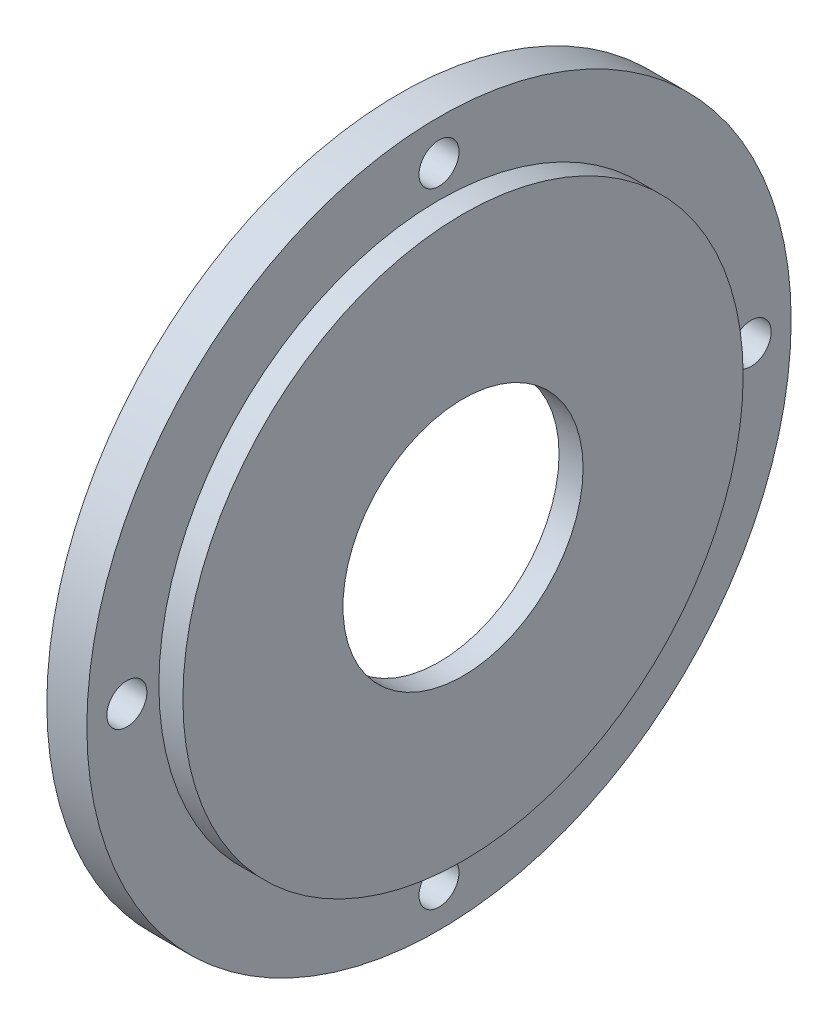
ISO-10303-21;
HEADER;
FILE_DESCRIPTION(('STEP AP214'),'2;1');
FILE_NAME('part.step','',(''),(''),'','','');
FILE_SCHEMA(('AUTOMOTIVE_DESIGN { 1 0 10303 214 1 1 1 1 }'));
ENDSEC;
DATA;
#1=APPLICATION_CONTEXT('core data for automotive mechanical design processes');
#2=APPLICATION_PROTOCOL_DEFINITION('international standard','automotive_design',2000,#1);
#3=PRODUCT_CONTEXT('',#1,'mechanical');
#4=PRODUCT('Part','Part','',(#3));
#5=PRODUCT_RELATED_PRODUCT_CATEGORY('part','',(#4));
#6=PRODUCT_DEFINITION_FORMATION('','',#4);
#7=PRODUCT_DEFINITION_CONTEXT('part definition',#1,'design');
#8=PRODUCT_DEFINITION('design','',#6,#7);
#9=PRODUCT_DEFINITION_SHAPE('','',#8);
#10=(LENGTH_UNIT() NAMED_UNIT(*) SI_UNIT(.MILLI.,.METRE.));
#11=(NAMED_UNIT(*) PLANE_ANGLE_UNIT() SI_UNIT($,.RADIAN.));
#12=(NAMED_UNIT(*) SI_UNIT($,.STERADIAN.) SOLID_ANGLE_UNIT());
#13=UNCERTAINTY_MEASURE_WITH_UNIT(LENGTH_MEASURE(1.E-05),#10,'distance_accuracy_value','');
#14=(GEOMETRIC_REPRESENTATION_CONTEXT(3) GLOBAL_UNCERTAINTY_ASSIGNED_CONTEXT((#13)) GLOBAL_UNIT_ASSIGNED_CONTEXT((#10,
#11,#12)) REPRESENTATION_CONTEXT('',''));
#15=CARTESIAN_POINT('',(0.,0.,0.));
#16=DIRECTION('',(0.,0.,1.));
#17=DIRECTION('',(1.,0.,0.));
#18=AXIS2_PLACEMENT_3D('',#15,#16,#17);
#19=CARTESIAN_POINT('',(5.,0.,0.));
#20=DIRECTION('',(1.,0.,0.));
#21=DIRECTION('',(0.,0.,-1.));
#22=AXIS2_PLACEMENT_3D('',#19,#20,#21);
#23=PLANE('',#22);
#24=CARTESIAN_POINT('',(5.,39.,0.));
#25=DIRECTION('',(1.,0.,0.));
#26=DIRECTION('',(0.,0.,-1.));
#27=AXIS2_PLACEMENT_3D('',#24,#25,#26);
#28=CIRCLE('',#27,2.50000000000267);
#29=CARTESIAN_POINT('',(5.,39.,-2.50000000000267));
#30=VERTEX_POINT('',#29);
#31=EDGE_CURVE('E90',#30,#30,#28,.T.);
#32=ORIENTED_EDGE('',*,*,#31,.F.);
#33=EDGE_LOOP('',(#32));
#34=FACE_BOUND('',#33,.T.);
#35=CARTESIAN_POINT('',(5.,1.24216638436362E-12,-39.0000000000012));
#36=DIRECTION('',(1.,0.,0.));
#37=DIRECTION('',(0.,0.,-1.));
#38=AXIS2_PLACEMENT_3D('',#35,#36,#37);
#39=CIRCLE('',#38,2.50000000000267);
#40=CARTESIAN_POINT('',(5.,1.24216638436362E-12,-41.5000000000039));
#41=VERTEX_POINT('',#40);
#42=EDGE_CURVE('E82',#41,#41,#39,.T.);
#43=ORIENTED_EDGE('',*,*,#42,.F.);
#44=EDGE_LOOP('',(#43));
#45=FACE_BOUND('',#44,.T.);
#46=CARTESIAN_POINT('',(5.,-39.,-2.48433276872723E-12));
#47=DIRECTION('',(1.,0.,0.));
#48=DIRECTION('',(0.,0.,-1.));
#49=AXIS2_PLACEMENT_3D('',#46,#47,#48);
#50=CIRCLE('',#49,2.50000000000267);
#51=CARTESIAN_POINT('',(5.,-39.,-2.50000000000515));
#52=VERTEX_POINT('',#51);
#53=EDGE_CURVE('E72',#52,#52,#50,.T.);
#54=ORIENTED_EDGE('',*,*,#53,.F.);
#55=EDGE_LOOP('',(#54));
#56=FACE_BOUND('',#55,.T.);
#57=CARTESIAN_POINT('',(5.,-1.24694250688029E-12,38.9999999999988));
#58=DIRECTION('',(1.,0.,0.));
#59=DIRECTION('',(0.,0.,-1.));
#60=AXIS2_PLACEMENT_3D('',#57,#58,#59);
#61=CIRCLE('',#60,2.50000000000267);
#62=CARTESIAN_POINT('',(5.,-1.24694250688029E-12,36.4999999999961));
#63=VERTEX_POINT('',#62);
#64=EDGE_CURVE('E73',#63,#63,#61,.T.);
#65=ORIENTED_EDGE('',*,*,#64,.F.);
#66=EDGE_LOOP('',(#65));
#67=FACE_BOUND('',#66,.T.);
#68=CARTESIAN_POINT('',(5.,0.,0.));
#69=DIRECTION('',(1.,0.,0.));
#70=DIRECTION('',(0.,0.,-1.));
#71=AXIS2_PLACEMENT_3D('',#68,#69,#70);
#72=CIRCLE('',#71,35.);
#73=CARTESIAN_POINT('',(5.,0.,-35.));
#74=VERTEX_POINT('',#73);
#75=EDGE_CURVE('E60',#74,#74,#72,.T.);
#76=ORIENTED_EDGE('',*,*,#75,.F.);
#77=EDGE_LOOP('',(#76));
#78=FACE_BOUND('',#77,.T.);
#79=CARTESIAN_POINT('',(5.,0.,0.));
#80=DIRECTION('',(1.,0.,0.));
#81=DIRECTION('',(0.,0.,-1.));
#82=AXIS2_PLACEMENT_3D('',#79,#80,#81);
#83=CIRCLE('',#82,44.);
#84=CARTESIAN_POINT('',(5.,0.,-44.));
#85=VERTEX_POINT('',#84);
#86=EDGE_CURVE('E10',#85,#85,#83,.T.);
#87=ORIENTED_EDGE('',*,*,#86,.T.);
#88=EDGE_LOOP('',(#87));
#89=FACE_BOUND('',#88,.T.);
#90=ADVANCED_FACE('F37',(#34,#45,#56,#67,#78,#89),#23,.T.);
#91=CARTESIAN_POINT('',(0.,0.,0.));
#92=DIRECTION('',(1.,0.,0.));
#93=DIRECTION('',(0.,0.,-1.));
#94=AXIS2_PLACEMENT_3D('',#91,#92,#93);
#95=PLANE('',#94);
#96=CARTESIAN_POINT('',(0.,39.,0.));
#97=DIRECTION('',(1.,0.,0.));
#98=DIRECTION('',(0.,0.,-1.));
#99=AXIS2_PLACEMENT_3D('',#96,#97,#98);
#100=CIRCLE('',#99,2.50000000000267);
#101=CARTESIAN_POINT('',(0.,39.,-2.50000000000267));
#102=VERTEX_POINT('',#101);
#103=EDGE_CURVE('E64',#102,#102,#100,.F.);
#104=ORIENTED_EDGE('',*,*,#103,.F.);
#105=EDGE_LOOP('',(#104));
#106=FACE_BOUND('',#105,.T.);
#107=CARTESIAN_POINT('',(0.,1.24216638436362E-12,-39.0000000000012));
#108=DIRECTION('',(1.,0.,0.));
#109=DIRECTION('',(0.,0.,-1.));
#110=AXIS2_PLACEMENT_3D('',#107,#108,#109);
#111=CIRCLE('',#110,2.50000000000267);
#112=CARTESIAN_POINT('',(0.,1.24216638436362E-12,-41.5000000000039));
#113=VERTEX_POINT('',#112);
#114=EDGE_CURVE('E86',#113,#113,#111,.F.);
#115=ORIENTED_EDGE('',*,*,#114,.F.);
#116=EDGE_LOOP('',(#115));
#117=FACE_BOUND('',#116,.T.);
#118=CARTESIAN_POINT('',(0.,-39.,-2.48433276872723E-12));
#119=DIRECTION('',(1.,0.,0.));
#120=DIRECTION('',(0.,0.,-1.));
#121=AXIS2_PLACEMENT_3D('',#118,#119,#120);
#122=CIRCLE('',#121,2.50000000000267);
#123=CARTESIAN_POINT('',(0.,-39.,-2.50000000000515));
#124=VERTEX_POINT('',#123);
#125=EDGE_CURVE('E78',#124,#124,#122,.F.);
#126=ORIENTED_EDGE('',*,*,#125,.F.);
#127=EDGE_LOOP('',(#126));
#128=FACE_BOUND('',#127,.T.);
#129=CARTESIAN_POINT('',(0.,-1.24694250688029E-12,38.9999999999988));
#130=DIRECTION('',(1.,0.,0.));
#131=DIRECTION('',(0.,0.,-1.));
#132=AXIS2_PLACEMENT_3D('',#129,#130,#131);
#133=CIRCLE('',#132,2.50000000000267);
#134=CARTESIAN_POINT('',(0.,-1.24694250688029E-12,36.4999999999961));
#135=VERTEX_POINT('',#134);
#136=EDGE_CURVE('E68',#135,#135,#133,.F.);
#137=ORIENTED_EDGE('',*,*,#136,.F.);
#138=EDGE_LOOP('',(#137));
#139=FACE_BOUND('',#138,.T.);
#140=CARTESIAN_POINT('',(0.,0.,0.));
#141=DIRECTION('',(1.,0.,0.));
#142=DIRECTION('',(0.,0.,-1.));
#143=AXIS2_PLACEMENT_3D('',#140,#141,#142);
#144=CIRCLE('',#143,44.);
#145=CARTESIAN_POINT('',(0.,0.,-44.));
#146=VERTEX_POINT('',#145);
#147=EDGE_CURVE('E41',#146,#146,#144,.T.);
#148=ORIENTED_EDGE('',*,*,#147,.F.);
#149=EDGE_LOOP('',(#148));
#150=FACE_BOUND('',#149,.T.);
#151=CARTESIAN_POINT('',(0.,0.,0.));
#152=DIRECTION('',(1.,0.,0.));
#153=DIRECTION('',(0.,0.,-1.));
#154=AXIS2_PLACEMENT_3D('',#151,#152,#153);
#155=CIRCLE('',#154,27.);
#156=CARTESIAN_POINT('',(0.,0.,-27.));
#157=VERTEX_POINT('',#156);
#158=EDGE_CURVE('E50',#157,#157,#155,.T.);
#159=ORIENTED_EDGE('',*,*,#158,.T.);
#160=EDGE_LOOP('',(#159));
#161=FACE_BOUND('',#160,.T.);
#162=ADVANCED_FACE('F126',(#106,#117,#128,#139,#150,#161),#95,.F.);
#163=CARTESIAN_POINT('',(5.,0.,0.));
#164=DIRECTION('',(-1.,0.,0.));
#165=DIRECTION('',(0.,0.,1.));
#166=AXIS2_PLACEMENT_3D('',#163,#164,#165);
#167=CYLINDRICAL_SURFACE('',#166,44.);
#168=ORIENTED_EDGE('',*,*,#86,.F.);
#169=EDGE_LOOP('',(#168));
#170=FACE_BOUND('',#169,.T.);
#171=ORIENTED_EDGE('',*,*,#147,.T.);
#172=EDGE_LOOP('',(#171));
#173=FACE_BOUND('',#172,.T.);
#174=ADVANCED_FACE('F39',(#170,#173),#167,.T.);
#175=CARTESIAN_POINT('',(5.,0.,0.));
#176=DIRECTION('',(-1.,0.,0.));
#177=DIRECTION('',(0.,0.,1.));
#178=AXIS2_PLACEMENT_3D('',#175,#176,#177);
#179=CYLINDRICAL_SURFACE('',#178,27.);
#180=CARTESIAN_POINT('',(5.,0.,0.));
#181=DIRECTION('',(1.,0.,0.));
#182=DIRECTION('',(0.,0.,-1.));
#183=AXIS2_PLACEMENT_3D('',#180,#181,#182);
#184=CIRCLE('',#183,27.);
#185=CARTESIAN_POINT('',(5.,0.,-27.));
#186=VERTEX_POINT('',#185);
#187=EDGE_CURVE('E55',#186,#186,#184,.T.);
#188=ORIENTED_EDGE('',*,*,#187,.T.);
#189=EDGE_LOOP('',(#188));
#190=FACE_BOUND('',#189,.T.);
#191=ORIENTED_EDGE('',*,*,#158,.F.);
#192=EDGE_LOOP('',(#191));
#193=FACE_BOUND('',#192,.T.);
#194=ADVANCED_FACE('F136',(#190,#193),#179,.F.);
#195=CARTESIAN_POINT('',(5.,0.,0.));
#196=DIRECTION('',(1.,0.,0.));
#197=DIRECTION('',(0.,0.,-1.));
#198=AXIS2_PLACEMENT_3D('',#195,#196,#197);
#199=PLANE('',#198);
#200=CARTESIAN_POINT('',(5.,0.,0.));
#201=DIRECTION('',(1.,0.,0.));
#202=DIRECTION('',(0.,0.,-1.));
#203=AXIS2_PLACEMENT_3D('',#200,#201,#202);
#204=CIRCLE('',#203,15.);
#205=CARTESIAN_POINT('',(5.,0.,-15.));
#206=VERTEX_POINT('',#205);
#207=EDGE_CURVE('E77',#206,#206,#204,.T.);
#208=ORIENTED_EDGE('',*,*,#207,.T.);
#209=EDGE_LOOP('',(#208));
#210=FACE_BOUND('',#209,.T.);
#211=ORIENTED_EDGE('',*,*,#187,.F.);
#212=EDGE_LOOP('',(#211));
#213=FACE_BOUND('',#212,.T.);
#214=ADVANCED_FACE('F121',(#210,#213),#199,.F.);
#215=CARTESIAN_POINT('',(8.,0.,0.));
#216=DIRECTION('',(-1.,0.,0.));
#217=DIRECTION('',(0.,0.,1.));
#218=AXIS2_PLACEMENT_3D('',#215,#216,#217);
#219=CYLINDRICAL_SURFACE('',#218,35.);
#220=CARTESIAN_POINT('',(8.,0.,0.));
#221=DIRECTION('',(1.,0.,0.));
#222=DIRECTION('',(0.,0.,-1.));
#223=AXIS2_PLACEMENT_3D('',#220,#221,#222);
#224=CIRCLE('',#223,35.);
#225=CARTESIAN_POINT('',(8.,0.,-35.));
#226=VERTEX_POINT('',#225);
#227=EDGE_CURVE('E59',#226,#226,#224,.T.);
#228=ORIENTED_EDGE('',*,*,#227,.F.);
#229=EDGE_LOOP('',(#228));
#230=FACE_BOUND('',#229,.T.);
#231=ORIENTED_EDGE('',*,*,#75,.T.);
#232=EDGE_LOOP('',(#231));
#233=FACE_BOUND('',#232,.T.);
#234=ADVANCED_FACE('F115',(#230,#233),#219,.T.);
#235=CARTESIAN_POINT('',(8.,0.,0.));
#236=DIRECTION('',(1.,0.,0.));
#237=DIRECTION('',(0.,0.,-1.));
#238=AXIS2_PLACEMENT_3D('',#235,#236,#237);
#239=PLANE('',#238);
#240=CARTESIAN_POINT('',(8.,0.,0.));
#241=DIRECTION('',(1.,0.,0.));
#242=DIRECTION('',(0.,0.,-1.));
#243=AXIS2_PLACEMENT_3D('',#240,#241,#242);
#244=CIRCLE('',#243,15.);
#245=CARTESIAN_POINT('',(8.,0.,-15.));
#246=VERTEX_POINT('',#245);
#247=EDGE_CURVE('E103',#246,#246,#244,.T.);
#248=ORIENTED_EDGE('',*,*,#247,.F.);
#249=EDGE_LOOP('',(#248));
#250=FACE_BOUND('',#249,.T.);
#251=ORIENTED_EDGE('',*,*,#227,.T.);
#252=EDGE_LOOP('',(#251));
#253=FACE_BOUND('',#252,.T.);
#254=ADVANCED_FACE('F111',(#250,#253),#239,.T.);
#255=CARTESIAN_POINT('',(-7.07106781187304,-1.24694250688029E-12,38.9999999999988));
#256=DIRECTION('',(1.,0.,0.));
#257=DIRECTION('',(0.,0.,-1.));
#258=AXIS2_PLACEMENT_3D('',#255,#256,#257);
#259=CYLINDRICAL_SURFACE('',#258,2.50000000000267);
#260=ORIENTED_EDGE('',*,*,#136,.T.);
#261=EDGE_LOOP('',(#260));
#262=FACE_BOUND('',#261,.T.);
#263=ORIENTED_EDGE('',*,*,#64,.T.);
#264=EDGE_LOOP('',(#263));
#265=FACE_BOUND('',#264,.T.);
#266=ADVANCED_FACE('F114',(#262,#265),#259,.F.);
#267=CARTESIAN_POINT('',(-7.07106781187304,-39.,-2.48433276872723E-12));
#268=DIRECTION('',(1.,0.,0.));
#269=DIRECTION('',(0.,0.,-1.));
#270=AXIS2_PLACEMENT_3D('',#267,#268,#269);
#271=CYLINDRICAL_SURFACE('',#270,2.50000000000267);
#272=ORIENTED_EDGE('',*,*,#125,.T.);
#273=EDGE_LOOP('',(#272));
#274=FACE_BOUND('',#273,.T.);
#275=ORIENTED_EDGE('',*,*,#53,.T.);
#276=EDGE_LOOP('',(#275));
#277=FACE_BOUND('',#276,.T.);
#278=ADVANCED_FACE('F145',(#274,#277),#271,.F.);
#279=CARTESIAN_POINT('',(-7.07106781187304,1.24216638436362E-12,-39.0000000000012));
#280=DIRECTION('',(1.,0.,0.));
#281=DIRECTION('',(0.,0.,-1.));
#282=AXIS2_PLACEMENT_3D('',#279,#280,#281);
#283=CYLINDRICAL_SURFACE('',#282,2.50000000000267);
#284=ORIENTED_EDGE('',*,*,#114,.T.);
#285=EDGE_LOOP('',(#284));
#286=FACE_BOUND('',#285,.T.);
#287=ORIENTED_EDGE('',*,*,#42,.T.);
#288=EDGE_LOOP('',(#287));
#289=FACE_BOUND('',#288,.T.);
#290=ADVANCED_FACE('F149',(#286,#289),#283,.F.);
#291=CARTESIAN_POINT('',(-7.07106781187304,39.,0.));
#292=DIRECTION('',(1.,0.,0.));
#293=DIRECTION('',(0.,0.,-1.));
#294=AXIS2_PLACEMENT_3D('',#291,#292,#293);
#295=CYLINDRICAL_SURFACE('',#294,2.50000000000267);
#296=ORIENTED_EDGE('',*,*,#103,.T.);
#297=EDGE_LOOP('',(#296));
#298=FACE_BOUND('',#297,.T.);
#299=ORIENTED_EDGE('',*,*,#31,.T.);
#300=EDGE_LOOP('',(#299));
#301=FACE_BOUND('',#300,.T.);
#302=ADVANCED_FACE('F153',(#298,#301),#295,.F.);
#303=CARTESIAN_POINT('',(-42.4264068711929,0.,0.));
#304=DIRECTION('',(1.,0.,0.));
#305=DIRECTION('',(0.,0.,-1.));
#306=AXIS2_PLACEMENT_3D('',#303,#304,#305);
#307=CYLINDRICAL_SURFACE('',#306,15.);
#308=ORIENTED_EDGE('',*,*,#247,.T.);
#309=EDGE_LOOP('',(#308));
#310=FACE_BOUND('',#309,.T.);
#311=ORIENTED_EDGE('',*,*,#207,.F.);
#312=EDGE_LOOP('',(#311));
#313=FACE_BOUND('',#312,.T.);
#314=ADVANCED_FACE('F108',(#310,#313),#307,.F.);
#315=CLOSED_SHELL('',(#90,#162,#174,#194,#214,#234,#254,#266,#278,#290,#302,#314));
#316=MANIFOLD_SOLID_BREP('B2',#315);
#317=ADVANCED_BREP_SHAPE_REPRESENTATION('',(#18,#316),#14);
#318=SHAPE_DEFINITION_REPRESENTATION(#9,#317);
ENDSEC;
END-ISO-10303-21;
